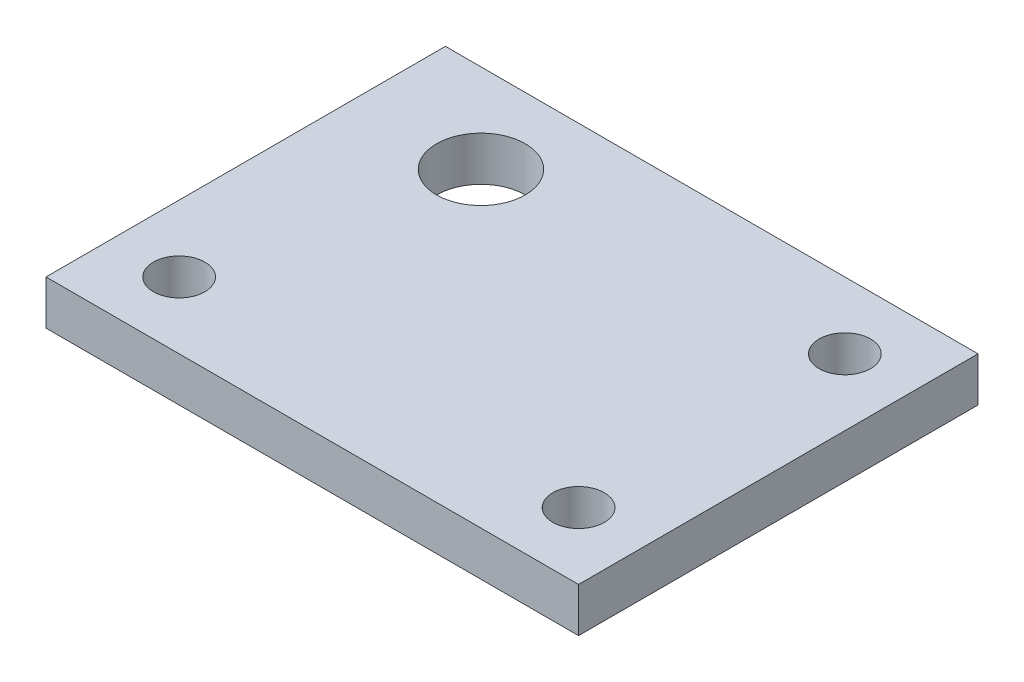
ISO-10303-21;
HEADER;
FILE_DESCRIPTION(('STEP AP214'),'2;1');
FILE_NAME('part.step','',(''),(''),'','','');
FILE_SCHEMA(('AUTOMOTIVE_DESIGN { 1 0 10303 214 1 1 1 1 }'));
ENDSEC;
DATA;
#1=APPLICATION_CONTEXT('core data for automotive mechanical design processes');
#2=APPLICATION_PROTOCOL_DEFINITION('international standard','automotive_design',2000,#1);
#3=PRODUCT_CONTEXT('',#1,'mechanical');
#4=PRODUCT('Part','Part','',(#3));
#5=PRODUCT_RELATED_PRODUCT_CATEGORY('part','',(#4));
#6=PRODUCT_DEFINITION_FORMATION('','',#4);
#7=PRODUCT_DEFINITION_CONTEXT('part definition',#1,'design');
#8=PRODUCT_DEFINITION('design','',#6,#7);
#9=PRODUCT_DEFINITION_SHAPE('','',#8);
#10=(LENGTH_UNIT() NAMED_UNIT(*) SI_UNIT(.MILLI.,.METRE.));
#11=(NAMED_UNIT(*) PLANE_ANGLE_UNIT() SI_UNIT($,.RADIAN.));
#12=(NAMED_UNIT(*) SI_UNIT($,.STERADIAN.) SOLID_ANGLE_UNIT());
#13=UNCERTAINTY_MEASURE_WITH_UNIT(LENGTH_MEASURE(1.E-05),#10,'distance_accuracy_value','');
#14=(GEOMETRIC_REPRESENTATION_CONTEXT(3) GLOBAL_UNCERTAINTY_ASSIGNED_CONTEXT((#13)) GLOBAL_UNIT_ASSIGNED_CONTEXT((#10,
#11,#12)) REPRESENTATION_CONTEXT('',''));
#15=CARTESIAN_POINT('',(0.,0.,0.));
#16=DIRECTION('',(0.,0.,1.));
#17=DIRECTION('',(1.,0.,0.));
#18=AXIS2_PLACEMENT_3D('',#15,#16,#17);
#19=CARTESIAN_POINT('',(0.,3.175,0.));
#20=DIRECTION('',(0.,-1.,0.));
#21=DIRECTION('',(0.,0.,-1.));
#22=AXIS2_PLACEMENT_3D('',#19,#20,#21);
#23=PLANE('',#22);
#24=CARTESIAN_POINT('',(-14.2875,3.175,9.525));
#25=DIRECTION('',(0.,1.,0.));
#26=DIRECTION('',(0.,0.,1.));
#27=AXIS2_PLACEMENT_3D('',#24,#25,#26);
#28=CIRCLE('',#27,1.8415);
#29=CARTESIAN_POINT('',(-14.2875,3.175,11.3665));
#30=VERTEX_POINT('',#29);
#31=EDGE_CURVE('E158',#30,#30,#28,.T.);
#32=ORIENTED_EDGE('',*,*,#31,.F.);
#33=EDGE_LOOP('',(#32));
#34=FACE_BOUND('',#33,.T.);
#35=CARTESIAN_POINT('',(14.2875,3.175,9.525));
#36=DIRECTION('',(0.,1.,0.));
#37=DIRECTION('',(0.,0.,1.));
#38=AXIS2_PLACEMENT_3D('',#35,#36,#37);
#39=CIRCLE('',#38,1.8415);
#40=CARTESIAN_POINT('',(14.2875,3.175,11.3665));
#41=VERTEX_POINT('',#40);
#42=EDGE_CURVE('E154',#41,#41,#39,.T.);
#43=ORIENTED_EDGE('',*,*,#42,.F.);
#44=EDGE_LOOP('',(#43));
#45=FACE_BOUND('',#44,.T.);
#46=CARTESIAN_POINT('',(14.2875,3.175,-9.525));
#47=DIRECTION('',(0.,1.,0.));
#48=DIRECTION('',(0.,0.,1.));
#49=AXIS2_PLACEMENT_3D('',#46,#47,#48);
#50=CIRCLE('',#49,1.8415);
#51=CARTESIAN_POINT('',(14.2875,3.175,-7.6835));
#52=VERTEX_POINT('',#51);
#53=EDGE_CURVE('E146',#52,#52,#50,.T.);
#54=ORIENTED_EDGE('',*,*,#53,.F.);
#55=EDGE_LOOP('',(#54));
#56=FACE_BOUND('',#55,.T.);
#57=DIRECTION('',(0.,0.,-1.));
#58=VECTOR('',#57,1.);
#59=CARTESIAN_POINT('',(19.05,3.175,14.2875));
#60=LINE('',#59,#58);
#61=CARTESIAN_POINT('',(19.05,3.175,14.2875));
#62=VERTEX_POINT('',#61);
#63=CARTESIAN_POINT('',(19.05,3.175,-14.2875));
#64=VERTEX_POINT('',#63);
#65=EDGE_CURVE('E96',#62,#64,#60,.T.);
#66=ORIENTED_EDGE('',*,*,#65,.T.);
#67=DIRECTION('',(-1.,0.,0.));
#68=VECTOR('',#67,1.);
#69=CARTESIAN_POINT('',(-19.05,3.175,-14.2875));
#70=LINE('',#69,#68);
#71=CARTESIAN_POINT('',(-19.05,3.175,-14.2875));
#72=VERTEX_POINT('',#71);
#73=EDGE_CURVE('E91',#64,#72,#70,.T.);
#74=ORIENTED_EDGE('',*,*,#73,.T.);
#75=DIRECTION('',(0.,0.,1.));
#76=VECTOR('',#75,1.);
#77=CARTESIAN_POINT('',(-19.05,3.175,14.2875));
#78=LINE('',#77,#76);
#79=CARTESIAN_POINT('',(-19.05,3.175,14.2875));
#80=VERTEX_POINT('',#79);
#81=EDGE_CURVE('E94',#72,#80,#78,.T.);
#82=ORIENTED_EDGE('',*,*,#81,.T.);
#83=DIRECTION('',(1.,0.,0.));
#84=VECTOR('',#83,1.);
#85=CARTESIAN_POINT('',(-19.05,3.175,14.2875));
#86=LINE('',#85,#84);
#87=EDGE_CURVE('E61',#80,#62,#86,.T.);
#88=ORIENTED_EDGE('',*,*,#87,.T.);
#89=EDGE_LOOP('',(#66,#74,#82,#88));
#90=FACE_BOUND('',#89,.T.);
#91=CARTESIAN_POINT('',(-10.16,3.175,-7.9375));
#92=DIRECTION('',(0.,1.,0.));
#93=DIRECTION('',(0.,0.,1.));
#94=AXIS2_PLACEMENT_3D('',#91,#92,#93);
#95=CIRCLE('',#94,3.175);
#96=CARTESIAN_POINT('',(-10.16,3.175,-4.7625));
#97=VERTEX_POINT('',#96);
#98=EDGE_CURVE('E116',#97,#97,#95,.T.);
#99=ORIENTED_EDGE('',*,*,#98,.F.);
#100=EDGE_LOOP('',(#99));
#101=FACE_BOUND('',#100,.T.);
#102=ADVANCED_FACE('F43',(#34,#45,#56,#90,#101),#23,.F.);
#103=CARTESIAN_POINT('',(0.,0.,0.));
#104=DIRECTION('',(0.,-1.,0.));
#105=DIRECTION('',(0.,0.,-1.));
#106=AXIS2_PLACEMENT_3D('',#103,#104,#105);
#107=PLANE('',#106);
#108=CARTESIAN_POINT('',(-14.2875,0.,9.525));
#109=DIRECTION('',(0.,1.,0.));
#110=DIRECTION('',(0.,0.,1.));
#111=AXIS2_PLACEMENT_3D('',#108,#109,#110);
#112=CIRCLE('',#111,1.8415);
#113=CARTESIAN_POINT('',(-14.2875,0.,11.3665));
#114=VERTEX_POINT('',#113);
#115=EDGE_CURVE('E138',#114,#114,#112,.T.);
#116=ORIENTED_EDGE('',*,*,#115,.T.);
#117=EDGE_LOOP('',(#116));
#118=FACE_BOUND('',#117,.T.);
#119=CARTESIAN_POINT('',(14.2875,0.,9.525));
#120=DIRECTION('',(0.,1.,0.));
#121=DIRECTION('',(0.,0.,1.));
#122=AXIS2_PLACEMENT_3D('',#119,#120,#121);
#123=CIRCLE('',#122,1.8415);
#124=CARTESIAN_POINT('',(14.2875,0.,11.3665));
#125=VERTEX_POINT('',#124);
#126=EDGE_CURVE('E150',#125,#125,#123,.T.);
#127=ORIENTED_EDGE('',*,*,#126,.T.);
#128=EDGE_LOOP('',(#127));
#129=FACE_BOUND('',#128,.T.);
#130=CARTESIAN_POINT('',(14.2875,0.,-9.525));
#131=DIRECTION('',(0.,1.,0.));
#132=DIRECTION('',(0.,0.,1.));
#133=AXIS2_PLACEMENT_3D('',#130,#131,#132);
#134=CIRCLE('',#133,1.8415);
#135=CARTESIAN_POINT('',(14.2875,0.,-7.6835));
#136=VERTEX_POINT('',#135);
#137=EDGE_CURVE('E142',#136,#136,#134,.T.);
#138=ORIENTED_EDGE('',*,*,#137,.T.);
#139=EDGE_LOOP('',(#138));
#140=FACE_BOUND('',#139,.T.);
#141=DIRECTION('',(0.,0.,-1.));
#142=VECTOR('',#141,1.);
#143=CARTESIAN_POINT('',(19.05,0.,14.2875));
#144=LINE('',#143,#142);
#145=CARTESIAN_POINT('',(19.05,0.,14.2875));
#146=VERTEX_POINT('',#145);
#147=CARTESIAN_POINT('',(19.05,0.,-14.2875));
#148=VERTEX_POINT('',#147);
#149=EDGE_CURVE('E112',#146,#148,#144,.T.);
#150=ORIENTED_EDGE('',*,*,#149,.F.);
#151=DIRECTION('',(1.,0.,0.));
#152=VECTOR('',#151,1.);
#153=CARTESIAN_POINT('',(-19.05,0.,14.2875));
#154=LINE('',#153,#152);
#155=CARTESIAN_POINT('',(-19.05,0.,14.2875));
#156=VERTEX_POINT('',#155);
#157=EDGE_CURVE('E84',#156,#146,#154,.T.);
#158=ORIENTED_EDGE('',*,*,#157,.F.);
#159=DIRECTION('',(0.,0.,1.));
#160=VECTOR('',#159,1.);
#161=CARTESIAN_POINT('',(-19.05,0.,14.2875));
#162=LINE('',#161,#160);
#163=CARTESIAN_POINT('',(-19.05,0.,-14.2875));
#164=VERTEX_POINT('',#163);
#165=EDGE_CURVE('E78',#164,#156,#162,.T.);
#166=ORIENTED_EDGE('',*,*,#165,.F.);
#167=DIRECTION('',(-1.,0.,0.));
#168=VECTOR('',#167,1.);
#169=CARTESIAN_POINT('',(-19.05,0.,-14.2875));
#170=LINE('',#169,#168);
#171=EDGE_CURVE('E101',#148,#164,#170,.T.);
#172=ORIENTED_EDGE('',*,*,#171,.F.);
#173=EDGE_LOOP('',(#150,#158,#166,#172));
#174=FACE_BOUND('',#173,.T.);
#175=CARTESIAN_POINT('',(-10.16,0.,-7.9375));
#176=DIRECTION('',(0.,1.,0.));
#177=DIRECTION('',(0.,0.,1.));
#178=AXIS2_PLACEMENT_3D('',#175,#176,#177);
#179=CIRCLE('',#178,3.175);
#180=CARTESIAN_POINT('',(-10.16,0.,-4.7625));
#181=VERTEX_POINT('',#180);
#182=EDGE_CURVE('E134',#181,#181,#179,.T.);
#183=ORIENTED_EDGE('',*,*,#182,.T.);
#184=EDGE_LOOP('',(#183));
#185=FACE_BOUND('',#184,.T.);
#186=ADVANCED_FACE('F129',(#118,#129,#140,#174,#185),#107,.T.);
#187=CARTESIAN_POINT('',(19.05,3.175,14.2875));
#188=DIRECTION('',(-1.,0.,0.));
#189=DIRECTION('',(0.,0.,1.));
#190=AXIS2_PLACEMENT_3D('',#187,#188,#189);
#191=PLANE('',#190);
#192=ORIENTED_EDGE('',*,*,#149,.T.);
#193=DIRECTION('',(0.,-1.,0.));
#194=VECTOR('',#193,1.);
#195=CARTESIAN_POINT('',(19.05,3.175,-14.2875));
#196=LINE('',#195,#194);
#197=EDGE_CURVE('E11',#64,#148,#196,.T.);
#198=ORIENTED_EDGE('',*,*,#197,.F.);
#199=ORIENTED_EDGE('',*,*,#65,.F.);
#200=DIRECTION('',(0.,-1.,0.));
#201=VECTOR('',#200,1.);
#202=CARTESIAN_POINT('',(19.05,3.175,14.2875));
#203=LINE('',#202,#201);
#204=EDGE_CURVE('E108',#62,#146,#203,.T.);
#205=ORIENTED_EDGE('',*,*,#204,.T.);
#206=EDGE_LOOP('',(#192,#198,#199,#205));
#207=FACE_BOUND('',#206,.T.);
#208=ADVANCED_FACE('F45',(#207),#191,.F.);
#209=CARTESIAN_POINT('',(-19.05,3.175,-14.2875));
#210=DIRECTION('',(0.,0.,1.));
#211=DIRECTION('',(1.,0.,0.));
#212=AXIS2_PLACEMENT_3D('',#209,#210,#211);
#213=PLANE('',#212);
#214=ORIENTED_EDGE('',*,*,#171,.T.);
#215=DIRECTION('',(0.,-1.,0.));
#216=VECTOR('',#215,1.);
#217=CARTESIAN_POINT('',(-19.05,3.175,-14.2875));
#218=LINE('',#217,#216);
#219=EDGE_CURVE('E53',#72,#164,#218,.T.);
#220=ORIENTED_EDGE('',*,*,#219,.F.);
#221=ORIENTED_EDGE('',*,*,#73,.F.);
#222=ORIENTED_EDGE('',*,*,#197,.T.);
#223=EDGE_LOOP('',(#214,#220,#221,#222));
#224=FACE_BOUND('',#223,.T.);
#225=ADVANCED_FACE('F100',(#224),#213,.F.);
#226=CARTESIAN_POINT('',(-19.05,3.175,14.2875));
#227=DIRECTION('',(1.,0.,0.));
#228=DIRECTION('',(0.,0.,-1.));
#229=AXIS2_PLACEMENT_3D('',#226,#227,#228);
#230=PLANE('',#229);
#231=ORIENTED_EDGE('',*,*,#165,.T.);
#232=DIRECTION('',(0.,-1.,0.));
#233=VECTOR('',#232,1.);
#234=CARTESIAN_POINT('',(-19.05,3.175,14.2875));
#235=LINE('',#234,#233);
#236=EDGE_CURVE('E103',#80,#156,#235,.T.);
#237=ORIENTED_EDGE('',*,*,#236,.F.);
#238=ORIENTED_EDGE('',*,*,#81,.F.);
#239=ORIENTED_EDGE('',*,*,#219,.T.);
#240=EDGE_LOOP('',(#231,#237,#238,#239));
#241=FACE_BOUND('',#240,.T.);
#242=ADVANCED_FACE('F104',(#241),#230,.F.);
#243=CARTESIAN_POINT('',(-19.05,3.175,14.2875));
#244=DIRECTION('',(0.,0.,-1.));
#245=DIRECTION('',(-1.,0.,0.));
#246=AXIS2_PLACEMENT_3D('',#243,#244,#245);
#247=PLANE('',#246);
#248=ORIENTED_EDGE('',*,*,#157,.T.);
#249=ORIENTED_EDGE('',*,*,#204,.F.);
#250=ORIENTED_EDGE('',*,*,#87,.F.);
#251=ORIENTED_EDGE('',*,*,#236,.T.);
#252=EDGE_LOOP('',(#248,#249,#250,#251));
#253=FACE_BOUND('',#252,.T.);
#254=ADVANCED_FACE('F126',(#253),#247,.F.);
#255=CARTESIAN_POINT('',(-10.16,3.175,-7.9375));
#256=DIRECTION('',(0.,-1.,0.));
#257=DIRECTION('',(0.,0.,-1.));
#258=AXIS2_PLACEMENT_3D('',#255,#256,#257);
#259=CYLINDRICAL_SURFACE('',#258,3.175);
#260=ORIENTED_EDGE('',*,*,#98,.T.);
#261=EDGE_LOOP('',(#260));
#262=FACE_BOUND('',#261,.T.);
#263=ORIENTED_EDGE('',*,*,#182,.F.);
#264=EDGE_LOOP('',(#263));
#265=FACE_BOUND('',#264,.T.);
#266=ADVANCED_FACE('F184',(#262,#265),#259,.F.);
#267=CARTESIAN_POINT('',(14.2875,0.,-9.525));
#268=DIRECTION('',(0.,1.,0.));
#269=DIRECTION('',(0.,0.,1.));
#270=AXIS2_PLACEMENT_3D('',#267,#268,#269);
#271=CYLINDRICAL_SURFACE('',#270,1.8415);
#272=ORIENTED_EDGE('',*,*,#137,.F.);
#273=EDGE_LOOP('',(#272));
#274=FACE_BOUND('',#273,.T.);
#275=ORIENTED_EDGE('',*,*,#53,.T.);
#276=EDGE_LOOP('',(#275));
#277=FACE_BOUND('',#276,.T.);
#278=ADVANCED_FACE('F182',(#274,#277),#271,.F.);
#279=CARTESIAN_POINT('',(14.2875,0.,9.525));
#280=DIRECTION('',(0.,1.,0.));
#281=DIRECTION('',(0.,0.,1.));
#282=AXIS2_PLACEMENT_3D('',#279,#280,#281);
#283=CYLINDRICAL_SURFACE('',#282,1.8415);
#284=ORIENTED_EDGE('',*,*,#126,.F.);
#285=EDGE_LOOP('',(#284));
#286=FACE_BOUND('',#285,.T.);
#287=ORIENTED_EDGE('',*,*,#42,.T.);
#288=EDGE_LOOP('',(#287));
#289=FACE_BOUND('',#288,.T.);
#290=ADVANCED_FACE('F171',(#286,#289),#283,.F.);
#291=CARTESIAN_POINT('',(-14.2875,0.,9.525));
#292=DIRECTION('',(0.,1.,0.));
#293=DIRECTION('',(0.,0.,1.));
#294=AXIS2_PLACEMENT_3D('',#291,#292,#293);
#295=CYLINDRICAL_SURFACE('',#294,1.8415);
#296=ORIENTED_EDGE('',*,*,#115,.F.);
#297=EDGE_LOOP('',(#296));
#298=FACE_BOUND('',#297,.T.);
#299=ORIENTED_EDGE('',*,*,#31,.T.);
#300=EDGE_LOOP('',(#299));
#301=FACE_BOUND('',#300,.T.);
#302=ADVANCED_FACE('F168',(#298,#301),#295,.F.);
#303=CLOSED_SHELL('',(#102,#186,#208,#225,#242,#254,#266,#278,#290,#302));
#304=MANIFOLD_SOLID_BREP('B2',#303);
#305=ADVANCED_BREP_SHAPE_REPRESENTATION('',(#18,#304),#14);
#306=SHAPE_DEFINITION_REPRESENTATION(#9,#305);
ENDSEC;
END-ISO-10303-21;
